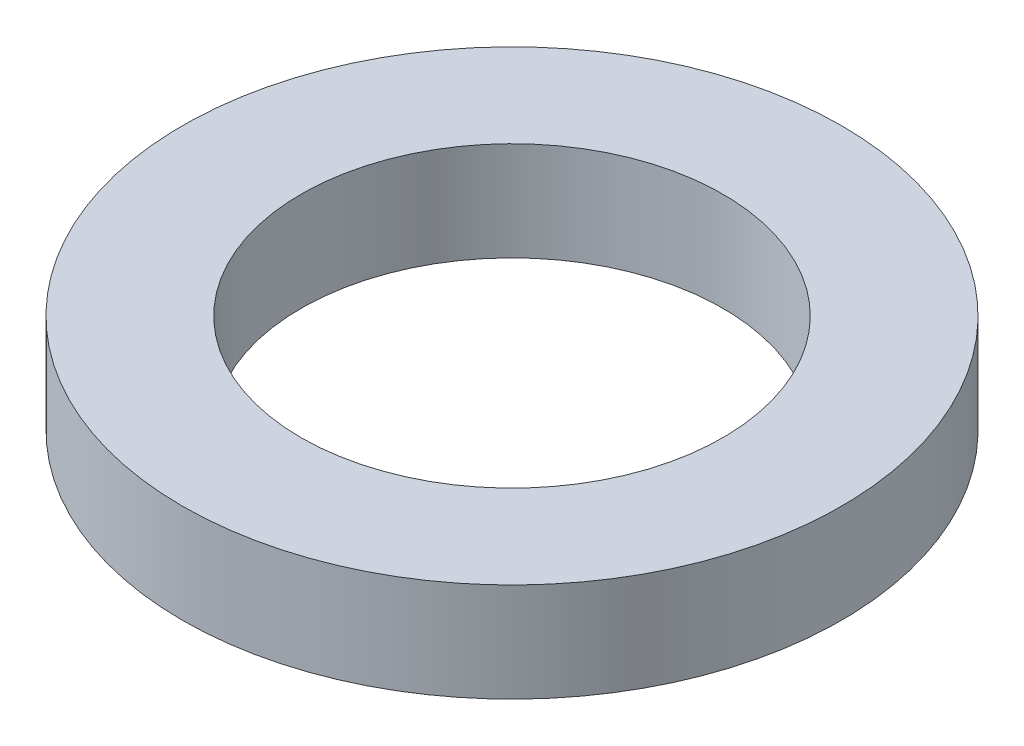
ISO-10303-21;
HEADER;
FILE_DESCRIPTION(('STEP AP214'),'2;1');
FILE_NAME('part.step','',(''),(''),'','','');
FILE_SCHEMA(('AUTOMOTIVE_DESIGN { 1 0 10303 214 1 1 1 1 }'));
ENDSEC;
DATA;
#1=APPLICATION_CONTEXT('core data for automotive mechanical design processes');
#2=APPLICATION_PROTOCOL_DEFINITION('international standard','automotive_design',2000,#1);
#3=PRODUCT_CONTEXT('',#1,'mechanical');
#4=PRODUCT('Part','Part','',(#3));
#5=PRODUCT_RELATED_PRODUCT_CATEGORY('part','',(#4));
#6=PRODUCT_DEFINITION_FORMATION('','',#4);
#7=PRODUCT_DEFINITION_CONTEXT('part definition',#1,'design');
#8=PRODUCT_DEFINITION('design','',#6,#7);
#9=PRODUCT_DEFINITION_SHAPE('','',#8);
#10=(LENGTH_UNIT() NAMED_UNIT(*) SI_UNIT(.MILLI.,.METRE.));
#11=(NAMED_UNIT(*) PLANE_ANGLE_UNIT() SI_UNIT($,.RADIAN.));
#12=(NAMED_UNIT(*) SI_UNIT($,.STERADIAN.) SOLID_ANGLE_UNIT());
#13=UNCERTAINTY_MEASURE_WITH_UNIT(LENGTH_MEASURE(1.E-05),#10,'distance_accuracy_value','');
#14=(GEOMETRIC_REPRESENTATION_CONTEXT(3) GLOBAL_UNCERTAINTY_ASSIGNED_CONTEXT((#13)) GLOBAL_UNIT_ASSIGNED_CONTEXT((#10,
#11,#12)) REPRESENTATION_CONTEXT('',''));
#15=CARTESIAN_POINT('',(0.,0.,0.));
#16=DIRECTION('',(0.,0.,1.));
#17=DIRECTION('',(1.,0.,0.));
#18=AXIS2_PLACEMENT_3D('',#15,#16,#17);
#19=CARTESIAN_POINT('',(0.,1.5,0.));
#20=DIRECTION('',(0.,1.,0.));
#21=DIRECTION('',(0.,0.,1.));
#22=AXIS2_PLACEMENT_3D('',#19,#20,#21);
#23=PLANE('',#22);
#24=CARTESIAN_POINT('',(0.,1.5,0.));
#25=DIRECTION('',(0.,1.,0.));
#26=DIRECTION('',(0.,0.,1.));
#27=AXIS2_PLACEMENT_3D('',#24,#25,#26);
#28=CIRCLE('',#27,5.);
#29=CARTESIAN_POINT('',(0.,1.5,5.));
#30=VERTEX_POINT('',#29);
#31=EDGE_CURVE('E10',#30,#30,#28,.T.);
#32=ORIENTED_EDGE('',*,*,#31,.T.);
#33=EDGE_LOOP('',(#32));
#34=FACE_BOUND('',#33,.T.);
#35=CARTESIAN_POINT('',(0.,1.5,0.));
#36=DIRECTION('',(0.,1.,0.));
#37=DIRECTION('',(0.,0.,1.));
#38=AXIS2_PLACEMENT_3D('',#35,#36,#37);
#39=CIRCLE('',#38,3.2);
#40=CARTESIAN_POINT('',(0.,1.5,3.2));
#41=VERTEX_POINT('',#40);
#42=EDGE_CURVE('E44',#41,#41,#39,.T.);
#43=ORIENTED_EDGE('',*,*,#42,.F.);
#44=EDGE_LOOP('',(#43));
#45=FACE_BOUND('',#44,.T.);
#46=ADVANCED_FACE('F33',(#34,#45),#23,.T.);
#47=CARTESIAN_POINT('',(0.,0.,0.));
#48=DIRECTION('',(0.,1.,0.));
#49=DIRECTION('',(0.,0.,1.));
#50=AXIS2_PLACEMENT_3D('',#47,#48,#49);
#51=PLANE('',#50);
#52=CARTESIAN_POINT('',(0.,0.,0.));
#53=DIRECTION('',(0.,1.,0.));
#54=DIRECTION('',(0.,0.,1.));
#55=AXIS2_PLACEMENT_3D('',#52,#53,#54);
#56=CIRCLE('',#55,5.);
#57=CARTESIAN_POINT('',(0.,0.,5.));
#58=VERTEX_POINT('',#57);
#59=EDGE_CURVE('E37',#58,#58,#56,.T.);
#60=ORIENTED_EDGE('',*,*,#59,.F.);
#61=EDGE_LOOP('',(#60));
#62=FACE_BOUND('',#61,.T.);
#63=CARTESIAN_POINT('',(0.,0.,0.));
#64=DIRECTION('',(0.,1.,0.));
#65=DIRECTION('',(0.,0.,1.));
#66=AXIS2_PLACEMENT_3D('',#63,#64,#65);
#67=CIRCLE('',#66,3.2);
#68=CARTESIAN_POINT('',(0.,0.,3.2));
#69=VERTEX_POINT('',#68);
#70=EDGE_CURVE('E46',#69,#69,#67,.T.);
#71=ORIENTED_EDGE('',*,*,#70,.T.);
#72=EDGE_LOOP('',(#71));
#73=FACE_BOUND('',#72,.T.);
#74=ADVANCED_FACE('F56',(#62,#73),#51,.F.);
#75=CARTESIAN_POINT('',(0.,1.5,0.));
#76=DIRECTION('',(0.,-1.,0.));
#77=DIRECTION('',(0.,0.,-1.));
#78=AXIS2_PLACEMENT_3D('',#75,#76,#77);
#79=CYLINDRICAL_SURFACE('',#78,5.);
#80=ORIENTED_EDGE('',*,*,#31,.F.);
#81=EDGE_LOOP('',(#80));
#82=FACE_BOUND('',#81,.T.);
#83=ORIENTED_EDGE('',*,*,#59,.T.);
#84=EDGE_LOOP('',(#83));
#85=FACE_BOUND('',#84,.T.);
#86=ADVANCED_FACE('F35',(#82,#85),#79,.T.);
#87=CARTESIAN_POINT('',(0.,1.5,0.));
#88=DIRECTION('',(0.,-1.,0.));
#89=DIRECTION('',(0.,0.,-1.));
#90=AXIS2_PLACEMENT_3D('',#87,#88,#89);
#91=CYLINDRICAL_SURFACE('',#90,3.2);
#92=ORIENTED_EDGE('',*,*,#42,.T.);
#93=EDGE_LOOP('',(#92));
#94=FACE_BOUND('',#93,.T.);
#95=ORIENTED_EDGE('',*,*,#70,.F.);
#96=EDGE_LOOP('',(#95));
#97=FACE_BOUND('',#96,.T.);
#98=ADVANCED_FACE('F52',(#94,#97),#91,.F.);
#99=CLOSED_SHELL('',(#46,#74,#86,#98));
#100=MANIFOLD_SOLID_BREP('B2',#99);
#101=ADVANCED_BREP_SHAPE_REPRESENTATION('',(#18,#100),#14);
#102=SHAPE_DEFINITION_REPRESENTATION(#9,#101);
ENDSEC;
END-ISO-10303-21;
